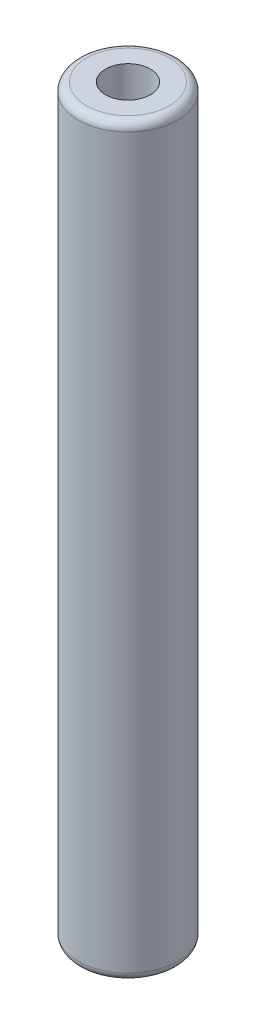
ISO-10303-21;
HEADER;
FILE_DESCRIPTION(('STEP AP214'),'2;1');
FILE_NAME('part.step','',(''),(''),'','','');
FILE_SCHEMA(('AUTOMOTIVE_DESIGN { 1 0 10303 214 1 1 1 1 }'));
ENDSEC;
DATA;
#1=APPLICATION_CONTEXT('core data for automotive mechanical design processes');
#2=APPLICATION_PROTOCOL_DEFINITION('international standard','automotive_design',2000,#1);
#3=PRODUCT_CONTEXT('',#1,'mechanical');
#4=PRODUCT('Part','Part','',(#3));
#5=PRODUCT_RELATED_PRODUCT_CATEGORY('part','',(#4));
#6=PRODUCT_DEFINITION_FORMATION('','',#4);
#7=PRODUCT_DEFINITION_CONTEXT('part definition',#1,'design');
#8=PRODUCT_DEFINITION('design','',#6,#7);
#9=PRODUCT_DEFINITION_SHAPE('','',#8);
#10=(LENGTH_UNIT() NAMED_UNIT(*) SI_UNIT(.MILLI.,.METRE.));
#11=(NAMED_UNIT(*) PLANE_ANGLE_UNIT() SI_UNIT($,.RADIAN.));
#12=(NAMED_UNIT(*) SI_UNIT($,.STERADIAN.) SOLID_ANGLE_UNIT());
#13=UNCERTAINTY_MEASURE_WITH_UNIT(LENGTH_MEASURE(1.E-05),#10,'distance_accuracy_value','');
#14=(GEOMETRIC_REPRESENTATION_CONTEXT(3) GLOBAL_UNCERTAINTY_ASSIGNED_CONTEXT((#13)) GLOBAL_UNIT_ASSIGNED_CONTEXT((#10,
#11,#12)) REPRESENTATION_CONTEXT('',''));
#15=CARTESIAN_POINT('',(0.,0.,0.));
#16=DIRECTION('',(0.,0.,1.));
#17=DIRECTION('',(1.,0.,0.));
#18=AXIS2_PLACEMENT_3D('',#15,#16,#17);
#19=CARTESIAN_POINT('',(0.,-22.5,0.));
#20=DIRECTION('',(0.,1.,0.));
#21=DIRECTION('',(0.,0.,1.));
#22=AXIS2_PLACEMENT_3D('',#19,#20,#21);
#23=CYLINDRICAL_SURFACE('',#22,3.);
#24=CARTESIAN_POINT('',(0.,-22.,0.));
#25=DIRECTION('',(0.,1.,0.));
#26=DIRECTION('',(0.,0.,1.));
#27=AXIS2_PLACEMENT_3D('',#24,#25,#26);
#28=CIRCLE('',#27,3.);
#29=CARTESIAN_POINT('',(0.,-22.,3.));
#30=VERTEX_POINT('',#29);
#31=EDGE_CURVE('E70',#30,#30,#28,.T.);
#32=CARTESIAN_POINT('',(0.,22.,0.));
#33=DIRECTION('',(0.,1.,0.));
#34=DIRECTION('',(0.,0.,1.));
#35=AXIS2_PLACEMENT_3D('',#32,#33,#34);
#36=CIRCLE('',#35,3.);
#37=CARTESIAN_POINT('',(0.,22.,3.));
#38=VERTEX_POINT('',#37);
#39=EDGE_CURVE('E67',#38,#38,#36,.F.);
#40=CARTESIAN_POINT('',(0.,-22.,3.));
#41=CARTESIAN_POINT('',(0.,-21.5416666666667,3.));
#42=CARTESIAN_POINT('',(0.,-21.0833333333333,3.));
#43=CARTESIAN_POINT('',(0.,-20.1666666666667,3.));
#44=CARTESIAN_POINT('',(0.,-19.7083333333333,3.));
#45=CARTESIAN_POINT('',(0.,-18.7916666666667,3.));
#46=CARTESIAN_POINT('',(0.,-18.3333333333333,3.));
#47=CARTESIAN_POINT('',(0.,-17.4166666666667,3.));
#48=CARTESIAN_POINT('',(0.,-16.9583333333333,3.));
#49=CARTESIAN_POINT('',(0.,-16.0416666666667,3.));
#50=CARTESIAN_POINT('',(0.,-15.5833333333333,3.));
#51=CARTESIAN_POINT('',(0.,-14.6666666666667,3.));
#52=CARTESIAN_POINT('',(0.,-14.2083333333333,3.));
#53=CARTESIAN_POINT('',(0.,-13.2916666666667,3.));
#54=CARTESIAN_POINT('',(0.,-12.8333333333333,3.));
#55=CARTESIAN_POINT('',(0.,-11.9166666666667,3.));
#56=CARTESIAN_POINT('',(0.,-11.4583333333333,3.));
#57=CARTESIAN_POINT('',(0.,-10.5416666666667,3.));
#58=CARTESIAN_POINT('',(0.,-10.0833333333333,3.));
#59=CARTESIAN_POINT('',(0.,-9.16666666666667,3.));
#60=CARTESIAN_POINT('',(0.,-8.70833333333334,3.));
#61=CARTESIAN_POINT('',(0.,-7.79166666666667,3.));
#62=CARTESIAN_POINT('',(0.,-7.33333333333334,3.));
#63=CARTESIAN_POINT('',(0.,-6.41666666666667,3.));
#64=CARTESIAN_POINT('',(0.,-5.95833333333334,3.));
#65=CARTESIAN_POINT('',(0.,-5.04166666666667,3.));
#66=CARTESIAN_POINT('',(0.,-4.58333333333334,3.));
#67=CARTESIAN_POINT('',(0.,-3.66666666666667,3.));
#68=CARTESIAN_POINT('',(0.,-3.20833333333334,3.));
#69=CARTESIAN_POINT('',(0.,-2.29166666666667,3.));
#70=CARTESIAN_POINT('',(0.,-1.83333333333334,3.));
#71=CARTESIAN_POINT('',(0.,-0.916666666666671,3.));
#72=CARTESIAN_POINT('',(0.,-0.458333333333337,3.));
#73=CARTESIAN_POINT('',(0.,0.45833333333333,3.));
#74=CARTESIAN_POINT('',(0.,0.916666666666664,3.));
#75=CARTESIAN_POINT('',(0.,1.83333333333333,3.));
#76=CARTESIAN_POINT('',(0.,2.29166666666666,3.));
#77=CARTESIAN_POINT('',(0.,3.20833333333333,3.));
#78=CARTESIAN_POINT('',(0.,3.66666666666666,3.));
#79=CARTESIAN_POINT('',(0.,4.58333333333333,3.));
#80=CARTESIAN_POINT('',(0.,5.04166666666666,3.));
#81=CARTESIAN_POINT('',(0.,5.95833333333333,3.));
#82=CARTESIAN_POINT('',(0.,6.41666666666666,3.));
#83=CARTESIAN_POINT('',(0.,7.33333333333333,3.));
#84=CARTESIAN_POINT('',(0.,7.79166666666666,3.));
#85=CARTESIAN_POINT('',(0.,8.70833333333333,3.));
#86=CARTESIAN_POINT('',(0.,9.16666666666666,3.));
#87=CARTESIAN_POINT('',(0.,10.0833333333333,3.));
#88=CARTESIAN_POINT('',(0.,10.5416666666667,3.));
#89=CARTESIAN_POINT('',(0.,11.4583333333333,3.));
#90=CARTESIAN_POINT('',(0.,11.9166666666667,3.));
#91=CARTESIAN_POINT('',(0.,12.8333333333333,3.));
#92=CARTESIAN_POINT('',(0.,13.2916666666667,3.));
#93=CARTESIAN_POINT('',(0.,14.2083333333333,3.));
#94=CARTESIAN_POINT('',(0.,14.6666666666667,3.));
#95=CARTESIAN_POINT('',(0.,15.5833333333333,3.));
#96=CARTESIAN_POINT('',(0.,16.0416666666667,3.));
#97=CARTESIAN_POINT('',(0.,16.9583333333333,3.));
#98=CARTESIAN_POINT('',(0.,17.4166666666667,3.));
#99=CARTESIAN_POINT('',(0.,18.3333333333333,3.));
#100=CARTESIAN_POINT('',(0.,18.7916666666667,3.));
#101=CARTESIAN_POINT('',(0.,19.7083333333333,3.));
#102=CARTESIAN_POINT('',(0.,20.1666666666667,3.));
#103=CARTESIAN_POINT('',(0.,21.0833333333333,3.));
#104=CARTESIAN_POINT('',(0.,21.5416666666667,3.));
#105=CARTESIAN_POINT('',(0.,22.,3.));
#106=B_SPLINE_CURVE_WITH_KNOTS('',3,(#40,#41,#42,#43,#44,#45,#46,#47,#48,#49,#50,#51,#52,#53,
#54,#55,#56,#57,#58,#59,#60,#61,#62,#63,#64,#65,#66,#67,#68,#69,#70,#71,#72,#73,#74,#75,#76,#77,
#78,#79,#80,#81,#82,#83,#84,#85,#86,#87,#88,#89,#90,#91,#92,#93,#94,#95,#96,#97,#98,#99,#100,
#101,#102,#103,#104,#105),.UNSPECIFIED.,.F.,.F.,(4,2,2,2,2,2,2,2,2,2,2,2,2,2,2,2,2,2,2,2,2,2,2,
2,2,2,2,2,2,2,2,2,4),(0.,1.375,2.75,4.125,5.5,6.875,8.25,9.625,11.,12.375,13.75,15.125,16.5,
17.875,19.25,20.625,22.,23.375,24.75,26.125,27.5,28.875,30.25,31.625,33.,34.375,35.75,37.125,
38.5,39.875,41.25,42.625,44.),.UNSPECIFIED.);
#107=EDGE_CURVE('BSEAM33',#30,#38,#106,.T.);
#108=ORIENTED_EDGE('',*,*,#31,.T.);
#109=ORIENTED_EDGE('',*,*,#39,.T.);
#110=ORIENTED_EDGE('',*,*,#107,.T.);
#111=ORIENTED_EDGE('',*,*,#107,.F.);
#112=EDGE_LOOP('',(#108,#110,#109,#111));
#113=FACE_BOUND('',#112,.T.);
#114=ADVANCED_FACE('F33',(#113),#23,.T.);
#115=CARTESIAN_POINT('',(0.,-22.5,0.));
#116=DIRECTION('',(0.,1.,0.));
#117=DIRECTION('',(0.,0.,1.));
#118=AXIS2_PLACEMENT_3D('',#115,#116,#117);
#119=PLANE('',#118);
#120=CARTESIAN_POINT('',(0.,-22.5,0.));
#121=DIRECTION('',(0.,-1.,0.));
#122=DIRECTION('',(0.,0.,-1.));
#123=AXIS2_PLACEMENT_3D('',#120,#121,#122);
#124=CIRCLE('',#123,1.35254999999999);
#125=CARTESIAN_POINT('',(0.,-22.5,-1.35254999999999));
#126=VERTEX_POINT('',#125);
#127=EDGE_CURVE('E57',#126,#126,#124,.T.);
#128=ORIENTED_EDGE('',*,*,#127,.F.);
#129=EDGE_LOOP('',(#128));
#130=FACE_BOUND('',#129,.T.);
#131=CARTESIAN_POINT('',(0.,-22.5,0.));
#132=DIRECTION('',(0.,1.,0.));
#133=DIRECTION('',(0.,0.,1.));
#134=AXIS2_PLACEMENT_3D('',#131,#132,#133);
#135=CIRCLE('',#134,2.5);
#136=CARTESIAN_POINT('',(0.,-22.5,2.5));
#137=VERTEX_POINT('',#136);
#138=EDGE_CURVE('E41',#137,#137,#135,.F.);
#139=ORIENTED_EDGE('',*,*,#138,.T.);
#140=EDGE_LOOP('',(#139));
#141=FACE_BOUND('',#140,.T.);
#142=ADVANCED_FACE('F75',(#130,#141),#119,.F.);
#143=CARTESIAN_POINT('',(0.,22.5,0.));
#144=DIRECTION('',(0.,1.,0.));
#145=DIRECTION('',(0.,0.,1.));
#146=AXIS2_PLACEMENT_3D('',#143,#144,#145);
#147=PLANE('',#146);
#148=CARTESIAN_POINT('',(0.,22.5,0.));
#149=DIRECTION('',(0.,1.,0.));
#150=DIRECTION('',(0.,0.,1.));
#151=AXIS2_PLACEMENT_3D('',#148,#149,#150);
#152=CIRCLE('',#151,2.5);
#153=CARTESIAN_POINT('',(0.,22.5,2.5));
#154=VERTEX_POINT('',#153);
#155=EDGE_CURVE('E11',#154,#154,#152,.T.);
#156=ORIENTED_EDGE('',*,*,#155,.T.);
#157=EDGE_LOOP('',(#156));
#158=FACE_BOUND('',#157,.T.);
#159=CARTESIAN_POINT('',(0.,22.5,0.));
#160=DIRECTION('',(0.,1.,0.));
#161=DIRECTION('',(0.,0.,1.));
#162=AXIS2_PLACEMENT_3D('',#159,#160,#161);
#163=CIRCLE('',#162,1.35254999999999);
#164=CARTESIAN_POINT('',(0.,22.5,1.35254999999999));
#165=VERTEX_POINT('',#164);
#166=EDGE_CURVE('E56',#165,#165,#163,.T.);
#167=ORIENTED_EDGE('',*,*,#166,.F.);
#168=EDGE_LOOP('',(#167));
#169=FACE_BOUND('',#168,.T.);
#170=ADVANCED_FACE('F92',(#158,#169),#147,.T.);
#171=CARTESIAN_POINT('',(0.,12.15,0.));
#172=DIRECTION('',(0.,1.,0.));
#173=DIRECTION('',(0.,0.,1.));
#174=AXIS2_PLACEMENT_3D('',#171,#172,#173);
#175=CONICAL_SURFACE('',#174,1.35254999999999,1.02974425867665);
#176=CARTESIAN_POINT('',(0.,11.3373059697343,0.));
#177=VERTEX_POINT('',#176);
#178=VERTEX_LOOP('',#177);
#179=FACE_BOUND('',#178,.T.);
#180=CARTESIAN_POINT('',(0.,12.15,0.));
#181=DIRECTION('',(0.,1.,0.));
#182=DIRECTION('',(0.,0.,1.));
#183=AXIS2_PLACEMENT_3D('',#180,#181,#182);
#184=CIRCLE('',#183,1.35254999999999);
#185=CARTESIAN_POINT('',(0.,12.15,1.35254999999999));
#186=VERTEX_POINT('',#185);
#187=EDGE_CURVE('E60',#186,#186,#184,.T.);
#188=ORIENTED_EDGE('',*,*,#187,.T.);
#189=EDGE_LOOP('',(#188));
#190=FACE_BOUND('',#189,.T.);
#191=ADVANCED_FACE('F95',(#179,#190),#175,.F.);
#192=CARTESIAN_POINT('',(0.,22.5,0.));
#193=DIRECTION('',(0.,1.,0.));
#194=DIRECTION('',(0.,0.,1.));
#195=AXIS2_PLACEMENT_3D('',#192,#193,#194);
#196=CYLINDRICAL_SURFACE('',#195,1.35254999999999);
#197=ORIENTED_EDGE('',*,*,#187,.F.);
#198=EDGE_LOOP('',(#197));
#199=FACE_BOUND('',#198,.T.);
#200=ORIENTED_EDGE('',*,*,#166,.T.);
#201=EDGE_LOOP('',(#200));
#202=FACE_BOUND('',#201,.T.);
#203=ADVANCED_FACE('F80',(#199,#202),#196,.F.);
#204=CARTESIAN_POINT('',(0.,-22.,0.));
#205=DIRECTION('',(0.,1.,0.));
#206=DIRECTION('',(0.,0.,1.));
#207=AXIS2_PLACEMENT_3D('',#204,#205,#206);
#208=TOROIDAL_SURFACE('',#207,2.5,0.5);
#209=ORIENTED_EDGE('',*,*,#138,.F.);
#210=EDGE_LOOP('',(#209));
#211=FACE_BOUND('',#210,.T.);
#212=ORIENTED_EDGE('',*,*,#31,.F.);
#213=EDGE_LOOP('',(#212));
#214=FACE_BOUND('',#213,.T.);
#215=ADVANCED_FACE('F77',(#211,#214),#208,.T.);
#216=CARTESIAN_POINT('',(0.,22.,0.));
#217=DIRECTION('',(0.,1.,0.));
#218=DIRECTION('',(0.,0.,1.));
#219=AXIS2_PLACEMENT_3D('',#216,#217,#218);
#220=TOROIDAL_SURFACE('',#219,2.5,0.5);
#221=ORIENTED_EDGE('',*,*,#39,.F.);
#222=EDGE_LOOP('',(#221));
#223=FACE_BOUND('',#222,.T.);
#224=ORIENTED_EDGE('',*,*,#155,.F.);
#225=EDGE_LOOP('',(#224));
#226=FACE_BOUND('',#225,.T.);
#227=ADVANCED_FACE('F35',(#223,#226),#220,.T.);
#228=CARTESIAN_POINT('',(0.,-12.15,0.));
#229=DIRECTION('',(0.,-1.,0.));
#230=DIRECTION('',(0.,0.,-1.));
#231=AXIS2_PLACEMENT_3D('',#228,#229,#230);
#232=CONICAL_SURFACE('',#231,1.35254999999999,1.02974425867665);
#233=CARTESIAN_POINT('',(0.,-11.3373059697343,0.));
#234=VERTEX_POINT('',#233);
#235=VERTEX_LOOP('',#234);
#236=FACE_BOUND('',#235,.T.);
#237=CARTESIAN_POINT('',(0.,-12.15,0.));
#238=DIRECTION('',(0.,-1.,0.));
#239=DIRECTION('',(0.,0.,-1.));
#240=AXIS2_PLACEMENT_3D('',#237,#238,#239);
#241=CIRCLE('',#240,1.35254999999999);
#242=CARTESIAN_POINT('',(0.,-12.15,-1.35254999999999));
#243=VERTEX_POINT('',#242);
#244=EDGE_CURVE('E54',#243,#243,#241,.T.);
#245=ORIENTED_EDGE('',*,*,#244,.T.);
#246=EDGE_LOOP('',(#245));
#247=FACE_BOUND('',#246,.T.);
#248=ADVANCED_FACE('F47',(#236,#247),#232,.F.);
#249=CARTESIAN_POINT('',(0.,-22.5,0.));
#250=DIRECTION('',(0.,-1.,0.));
#251=DIRECTION('',(0.,0.,-1.));
#252=AXIS2_PLACEMENT_3D('',#249,#250,#251);
#253=CYLINDRICAL_SURFACE('',#252,1.35254999999999);
#254=ORIENTED_EDGE('',*,*,#244,.F.);
#255=EDGE_LOOP('',(#254));
#256=FACE_BOUND('',#255,.T.);
#257=ORIENTED_EDGE('',*,*,#127,.T.);
#258=EDGE_LOOP('',(#257));
#259=FACE_BOUND('',#258,.T.);
#260=ADVANCED_FACE('F50',(#256,#259),#253,.F.);
#261=CLOSED_SHELL('',(#114,#142,#170,#191,#203,#215,#227,#248,#260));
#262=MANIFOLD_SOLID_BREP('B2',#261);
#263=ADVANCED_BREP_SHAPE_REPRESENTATION('',(#18,#262),#14);
#264=SHAPE_DEFINITION_REPRESENTATION(#9,#263);
ENDSEC;
END-ISO-10303-21;
